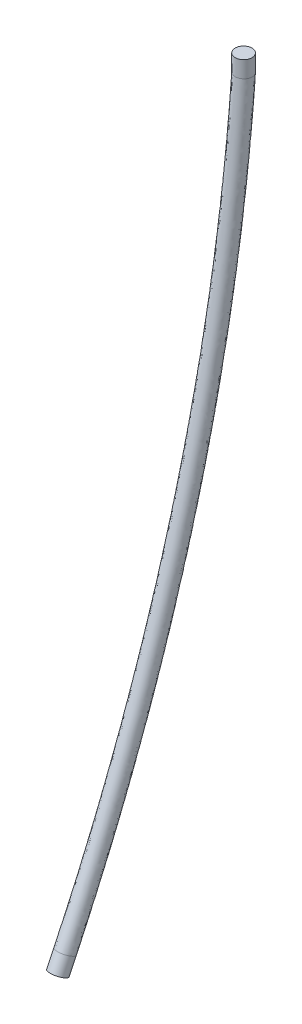
ISO-10303-21;
HEADER;
FILE_DESCRIPTION(('STEP AP214'),'2;1');
FILE_NAME('part.step','',(''),(''),'','','');
FILE_SCHEMA(('AUTOMOTIVE_DESIGN { 1 0 10303 214 1 1 1 1 }'));
ENDSEC;
DATA;
#1=APPLICATION_CONTEXT('core data for automotive mechanical design processes');
#2=APPLICATION_PROTOCOL_DEFINITION('international standard','automotive_design',2000,#1);
#3=PRODUCT_CONTEXT('',#1,'mechanical');
#4=PRODUCT('Part','Part','',(#3));
#5=PRODUCT_RELATED_PRODUCT_CATEGORY('part','',(#4));
#6=PRODUCT_DEFINITION_FORMATION('','',#4);
#7=PRODUCT_DEFINITION_CONTEXT('part definition',#1,'design');
#8=PRODUCT_DEFINITION('design','',#6,#7);
#9=PRODUCT_DEFINITION_SHAPE('','',#8);
#10=(LENGTH_UNIT() NAMED_UNIT(*) SI_UNIT(.MILLI.,.METRE.));
#11=(NAMED_UNIT(*) PLANE_ANGLE_UNIT() SI_UNIT($,.RADIAN.));
#12=(NAMED_UNIT(*) SI_UNIT($,.STERADIAN.) SOLID_ANGLE_UNIT());
#13=UNCERTAINTY_MEASURE_WITH_UNIT(LENGTH_MEASURE(1.E-05),#10,'distance_accuracy_value','');
#14=(GEOMETRIC_REPRESENTATION_CONTEXT(3) GLOBAL_UNCERTAINTY_ASSIGNED_CONTEXT((#13)) GLOBAL_UNIT_ASSIGNED_CONTEXT((#10,
#11,#12)) REPRESENTATION_CONTEXT('',''));
#15=CARTESIAN_POINT('',(0.,0.,0.));
#16=DIRECTION('',(0.,0.,1.));
#17=DIRECTION('',(1.,0.,0.));
#18=AXIS2_PLACEMENT_3D('',#15,#16,#17);
#19=CARTESIAN_POINT('',(2.53999999999998,-2082.79999999695,539.749999998546));
#20=DIRECTION('',(0.,-0.902771757915823,0.430119928751941));
#21=DIRECTION('',(0.,-0.430119928751941,-0.902771757915823));
#22=AXIS2_PLACEMENT_3D('',#19,#20,#21);
#23=CYLINDRICAL_SURFACE('',#22,25.4000000000003);
#24=CARTESIAN_POINT('',(2.53999999999998,-2082.79999999695,539.749999998546));
#25=DIRECTION('',(0.,-0.902771757916077,0.430119928751407));
#26=DIRECTION('',(0.,-0.430119928751407,-0.902771757916077));
#27=AXIS2_PLACEMENT_3D('',#24,#25,#26);
#28=CIRCLE('',#27,25.4000000000003);
#29=CARTESIAN_POINT('',(2.53999999999998,-2093.72504618723,516.819597347477));
#30=VERTEX_POINT('',#29);
#31=EDGE_CURVE('E49',#30,#30,#28,.T.);
#32=CARTESIAN_POINT('',(2.53999999999998,-2128.66080529907,561.600092379144));
#33=DIRECTION('',(0.,-0.902771757916077,0.430119928751407));
#34=DIRECTION('',(0.,-0.430119928751407,-0.902771757916077));
#35=AXIS2_PLACEMENT_3D('',#32,#33,#34);
#36=CIRCLE('',#35,25.4000000000003);
#37=CARTESIAN_POINT('',(2.53999999999998,-2139.58585148936,538.669689728075));
#38=VERTEX_POINT('',#37);
#39=EDGE_CURVE('E11',#38,#38,#36,.T.);
#40=CARTESIAN_POINT('',(2.53999999999998,-2093.72504618723,516.819597347477));
#41=CARTESIAN_POINT('',(2.53999999999998,-2094.20276290913,517.047202476442));
#42=CARTESIAN_POINT('',(2.53999999999998,-2094.68047963103,517.274807605406));
#43=CARTESIAN_POINT('',(2.53999999999998,-2095.63591307482,517.730017863335));
#44=CARTESIAN_POINT('',(2.53999999999998,-2096.11362979672,517.9576229923));
#45=CARTESIAN_POINT('',(2.53999999999998,-2097.06906324051,518.412833250229));
#46=CARTESIAN_POINT('',(2.53999999999998,-2097.54677996241,518.640438379194));
#47=CARTESIAN_POINT('',(2.53999999999998,-2098.50221340621,519.095648637123));
#48=CARTESIAN_POINT('',(2.53999999999998,-2098.9799301281,519.323253766087));
#49=CARTESIAN_POINT('',(2.53999999999998,-2099.9353635719,519.778464024017));
#50=CARTESIAN_POINT('',(2.53999999999998,-2100.41308029379,520.006069152981));
#51=CARTESIAN_POINT('',(2.53999999999998,-2101.36851373759,520.46127941091));
#52=CARTESIAN_POINT('',(2.53999999999998,-2101.84623045949,520.688884539875));
#53=CARTESIAN_POINT('',(2.53999999999998,-2102.80166390328,521.144094797804));
#54=CARTESIAN_POINT('',(2.53999999999998,-2103.27938062518,521.371699926768));
#55=CARTESIAN_POINT('',(2.53999999999998,-2104.23481406897,521.826910184698));
#56=CARTESIAN_POINT('',(2.53999999999998,-2104.71253079087,522.054515313662));
#57=CARTESIAN_POINT('',(2.53999999999998,-2105.66796423466,522.509725571591));
#58=CARTESIAN_POINT('',(2.53999999999998,-2106.14568095656,522.737330700556));
#59=CARTESIAN_POINT('',(2.53999999999998,-2107.10111440035,523.192540958485));
#60=CARTESIAN_POINT('',(2.53999999999998,-2107.57883112225,523.420146087449));
#61=CARTESIAN_POINT('',(2.53999999999998,-2108.53426456605,523.875356345379));
#62=CARTESIAN_POINT('',(2.53999999999998,-2109.01198128794,524.102961474343));
#63=CARTESIAN_POINT('',(2.53999999999998,-2109.96741473174,524.558171732272));
#64=CARTESIAN_POINT('',(2.53999999999998,-2110.44513145363,524.785776861237));
#65=CARTESIAN_POINT('',(2.53999999999998,-2111.40056489743,525.240987119166));
#66=CARTESIAN_POINT('',(2.53999999999998,-2111.87828161933,525.46859224813));
#67=CARTESIAN_POINT('',(2.53999999999998,-2112.83371506312,525.92380250606));
#68=CARTESIAN_POINT('',(2.53999999999998,-2113.31143178502,526.151407635024));
#69=CARTESIAN_POINT('',(2.53999999999998,-2114.26686522881,526.606617892953));
#70=CARTESIAN_POINT('',(2.53999999999998,-2114.74458195071,526.834223021918));
#71=CARTESIAN_POINT('',(2.53999999999998,-2115.7000153945,527.289433279847));
#72=CARTESIAN_POINT('',(2.53999999999998,-2116.1777321164,527.517038408812));
#73=CARTESIAN_POINT('',(2.53999999999998,-2117.13316556019,527.972248666741));
#74=CARTESIAN_POINT('',(2.53999999999998,-2117.61088228209,528.199853795705));
#75=CARTESIAN_POINT('',(2.53999999999998,-2118.56631572588,528.655064053634));
#76=CARTESIAN_POINT('',(2.53999999999998,-2119.04403244778,528.882669182599));
#77=CARTESIAN_POINT('',(2.53999999999998,-2119.99946589158,529.337879440528));
#78=CARTESIAN_POINT('',(2.53999999999998,-2120.47718261347,529.565484569493));
#79=CARTESIAN_POINT('',(2.53999999999998,-2121.43261605727,530.020694827422));
#80=CARTESIAN_POINT('',(2.53999999999998,-2121.91033277916,530.248299956386));
#81=CARTESIAN_POINT('',(2.53999999999998,-2122.86576622296,530.703510214316));
#82=CARTESIAN_POINT('',(2.53999999999998,-2123.34348294486,530.93111534328));
#83=CARTESIAN_POINT('',(2.53999999999998,-2124.29891638865,531.386325601209));
#84=CARTESIAN_POINT('',(2.53999999999998,-2124.77663311055,531.613930730174));
#85=CARTESIAN_POINT('',(2.53999999999998,-2125.73206655434,532.069140988103));
#86=CARTESIAN_POINT('',(2.53999999999998,-2126.20978327624,532.296746117067));
#87=CARTESIAN_POINT('',(2.53999999999998,-2127.16521672003,532.751956374997));
#88=CARTESIAN_POINT('',(2.53999999999998,-2127.64293344193,532.979561503961));
#89=CARTESIAN_POINT('',(2.53999999999998,-2128.59836688572,533.43477176189));
#90=CARTESIAN_POINT('',(2.53999999999998,-2129.07608360762,533.662376890855));
#91=CARTESIAN_POINT('',(2.53999999999998,-2130.03151705141,534.117587148784));
#92=CARTESIAN_POINT('',(2.53999999999998,-2130.50923377331,534.345192277748));
#93=CARTESIAN_POINT('',(2.53999999999998,-2131.46466721711,534.800402535678));
#94=CARTESIAN_POINT('',(2.53999999999998,-2131.942383939,535.028007664642));
#95=CARTESIAN_POINT('',(2.53999999999998,-2132.8978173828,535.483217922571));
#96=CARTESIAN_POINT('',(2.53999999999998,-2133.3755341047,535.710823051536));
#97=CARTESIAN_POINT('',(2.53999999999998,-2134.33096754849,536.166033309465));
#98=CARTESIAN_POINT('',(2.53999999999998,-2134.80868427039,536.393638438429));
#99=CARTESIAN_POINT('',(2.53999999999998,-2135.76411771418,536.848848696359));
#100=CARTESIAN_POINT('',(2.53999999999998,-2136.24183443608,537.076453825323));
#101=CARTESIAN_POINT('',(2.53999999999998,-2137.19726787987,537.531664083252));
#102=CARTESIAN_POINT('',(2.53999999999998,-2137.67498460177,537.759269212217));
#103=CARTESIAN_POINT('',(2.53999999999998,-2138.63041804556,538.214479470146));
#104=CARTESIAN_POINT('',(2.53999999999998,-2139.10813476746,538.442084599111));
#105=CARTESIAN_POINT('',(2.53999999999998,-2139.58585148936,538.669689728075));
#106=B_SPLINE_CURVE_WITH_KNOTS('',3,(#40,#41,#42,#43,#44,#45,#46,#47,#48,#49,#50,#51,#52,#53,
#54,#55,#56,#57,#58,#59,#60,#61,#62,#63,#64,#65,#66,#67,#68,#69,#70,#71,#72,#73,#74,#75,#76,#77,
#78,#79,#80,#81,#82,#83,#84,#85,#86,#87,#88,#89,#90,#91,#92,#93,#94,#95,#96,#97,#98,#99,#100,
#101,#102,#103,#104,#105),.UNSPECIFIED.,.F.,.F.,(4,2,2,2,2,2,2,2,2,2,2,2,2,2,2,2,2,2,2,2,2,2,2,
2,2,2,2,2,2,2,2,2,4),(0.,1.58749999999964,3.17499999999974,4.76249999999978,6.34999999999947,
7.93749999999952,9.52499999999961,11.1124999999997,12.6999999999994,14.2874999999994,
15.8749999999995,17.4624999999991,19.0499999999992,20.6374999999993,22.2249999999994,
23.812499999999,25.3999999999991,26.9874999999991,28.5749999999988,30.1624999999989,
31.749999999999,33.337499999999,34.9249999999987,36.5124999999988,38.0999999999989,
39.6874999999985,41.2749999999986,42.8624999999986,44.4499999999987,46.0374999999984,
47.6249999999985,49.2124999999985,50.7999999999986),.UNSPECIFIED.);
#107=EDGE_CURVE('BSEAM39',#30,#38,#106,.T.);
#108=ORIENTED_EDGE('',*,*,#31,.T.);
#109=ORIENTED_EDGE('',*,*,#39,.F.);
#110=ORIENTED_EDGE('',*,*,#107,.T.);
#111=ORIENTED_EDGE('',*,*,#107,.F.);
#112=EDGE_LOOP('',(#108,#110,#109,#111));
#113=FACE_BOUND('',#112,.T.);
#114=ADVANCED_FACE('F39',(#113),#23,.T.);
#115=CARTESIAN_POINT('',(2.53999999999999,0.,0.));
#116=DIRECTION('',(0.,1.,0.));
#117=DIRECTION('',(0.,0.,1.));
#118=AXIS2_PLACEMENT_3D('',#115,#116,#117);
#119=PLANE('',#118);
#120=CARTESIAN_POINT('',(2.53999999999999,0.,0.));
#121=DIRECTION('',(0.,1.,0.));
#122=DIRECTION('',(0.,0.,1.));
#123=AXIS2_PLACEMENT_3D('',#120,#121,#122);
#124=CIRCLE('',#123,25.4);
#125=CARTESIAN_POINT('',(2.53999999999999,0.,25.4));
#126=VERTEX_POINT('',#125);
#127=EDGE_CURVE('E45',#126,#126,#124,.T.);
#128=ORIENTED_EDGE('',*,*,#127,.T.);
#129=EDGE_LOOP('',(#128));
#130=FACE_BOUND('',#129,.T.);
#131=ADVANCED_FACE('F75',(#130),#119,.T.);
#132=CARTESIAN_POINT('',(2.53999999999999,-122.642048968553,0.));
#133=DIRECTION('',(0.,1.,0.));
#134=DIRECTION('',(0.,0.,1.));
#135=AXIS2_PLACEMENT_3D('',#132,#133,#134);
#136=CYLINDRICAL_SURFACE('',#135,25.4);
#137=ORIENTED_EDGE('',*,*,#127,.F.);
#138=EDGE_LOOP('',(#137));
#139=FACE_BOUND('',#138,.T.);
#140=CARTESIAN_POINT('',(2.53999999999999,-49.8517125381813,25.3999999998483));
#141=CARTESIAN_POINT('',(53.3399999999999,-49.8517125381813,25.3999999998483));
#142=CARTESIAN_POINT('',(53.3399999999999,-51.748287457762,-25.4000000001517));
#143=CARTESIAN_POINT('',(2.53999999999998,-51.748287457762,-25.4000000001517));
#144=CARTESIAN_POINT('',(-48.26,-51.748287457762,-25.4000000001517));
#145=CARTESIAN_POINT('',(-48.26,-49.8517125381813,25.3999999998483));
#146=CARTESIAN_POINT('',(2.53999999999999,-49.8517125381813,25.3999999998483));
#147=(BOUNDED_CURVE() B_SPLINE_CURVE(3,(#140,#141,#142,#143,#144,#145,#146),.UNSPECIFIED.,.T.,
.F.) B_SPLINE_CURVE_WITH_KNOTS((4,3,4),(0.,0.5,1.),
.UNSPECIFIED.) CURVE() GEOMETRIC_REPRESENTATION_ITEM() RATIONAL_B_SPLINE_CURVE((1.,
0.333333333333333,0.333333333333333,1.,0.333333333333333,0.333333333333333,1.)) REPRESENTATION_ITEM(''));
#148=CARTESIAN_POINT('',(2.53999999999999,-49.8517125381813,25.3999999998483));
#149=VERTEX_POINT('',#148);
#150=EDGE_CURVE('E53',#149,#149,#147,.T.);
#151=ORIENTED_EDGE('',*,*,#150,.T.);
#152=EDGE_LOOP('',(#151));
#153=FACE_BOUND('',#152,.T.);
#154=ADVANCED_FACE('F64',(#139,#153),#136,.T.);
#155=CARTESIAN_POINT('',(2.53999999999998,-2139.58585148936,538.669689728075));
#156=DIRECTION('',(0.,-0.902771757916077,0.430119928751407));
#157=DIRECTION('',(0.,-0.430119928751407,-0.902771757916077));
#158=AXIS2_PLACEMENT_3D('',#155,#156,#157);
#159=PLANE('',#158);
#160=ORIENTED_EDGE('',*,*,#39,.T.);
#161=EDGE_LOOP('',(#160));
#162=FACE_BOUND('',#161,.T.);
#163=ADVANCED_FACE('F69',(#162),#159,.T.);
#164=CARTESIAN_POINT('',(2.53999999999999,-49.8517125381813,25.3999999998483));
#165=CARTESIAN_POINT('',(2.53999999999999,-161.757048001423,33.7674444681181));
#166=CARTESIAN_POINT('',(2.53999999999999,-390.760875928582,57.7910151998846));
#167=CARTESIAN_POINT('',(2.53999999999999,-748.783675535288,117.735286481529));
#168=CARTESIAN_POINT('',(2.53999999999999,-1097.83172231654,200.253532329837));
#169=CARTESIAN_POINT('',(2.53999999999998,-1434.53576916788,302.167545080664));
#170=CARTESIAN_POINT('',(2.53999999999999,-1753.80606980275,419.349068322734));
#171=CARTESIAN_POINT('',(2.53999999999999,-1965.09749017698,511.806951363686));
#172=CARTESIAN_POINT('',(2.53999999999999,-2071.87495380666,562.680402649614));
#173=CARTESIAN_POINT('',(53.3399999999999,-49.8517125381813,25.3999999998483));
#174=CARTESIAN_POINT('',(53.3399999999999,-164.206288404259,33.9505803568167));
#175=CARTESIAN_POINT('',(53.3399999999999,-389.537054533492,57.7009261618553));
#176=CARTESIAN_POINT('',(53.34,-749.14037149146,117.756390758906));
#177=CARTESIAN_POINT('',(53.3399999999999,-1097.79985435071,200.271968516481));
#178=CARTESIAN_POINT('',(53.3399999999999,-1434.39665143896,302.09247667257));
#179=CARTESIAN_POINT('',(53.3399999999999,-1754.44595029853,419.656598277657));
#180=CARTESIAN_POINT('',(53.3399999999999,-1963.65191334442,511.118215369486));
#181=CARTESIAN_POINT('',(53.3399999999999,-2071.87495380666,562.680402649614));
#182=CARTESIAN_POINT('',(53.3399999999999,-51.748287457762,-25.4000000001517));
#183=CARTESIAN_POINT('',(53.3399999999999,-166.10286332384,-16.8494196431833));
#184=CARTESIAN_POINT('',(53.3399999999999,-397.856601291546,7.44244698382292));
#185=CARTESIAN_POINT('',(53.34,-758.794818829185,67.9011802971091));
#186=CARTESIAN_POINT('',(53.3399999999999,-1111.03669784597,151.166655924957));
#187=CARTESIAN_POINT('',(53.3399999999999,-1450.61366841281,253.942952466131));
#188=CARTESIAN_POINT('',(53.3399999999999,-1772.96836411812,372.282535418023));
#189=CARTESIAN_POINT('',(53.3399999999999,-1985.502005725,465.257410067349));
#190=CARTESIAN_POINT('',(53.3399999999999,-2093.72504618724,516.819597347477));
#191=CARTESIAN_POINT('',(2.53999999999998,-51.748287457762,-25.4000000001517));
#192=CARTESIAN_POINT('',(2.53999999999998,-164.878243122422,-16.9409875875326));
#193=CARTESIAN_POINT('',(2.53999999999998,-398.468511989091,7.48749150283761));
#194=CARTESIAN_POINT('',(2.53999999999998,-758.616470851099,67.8906281584205));
#195=CARTESIAN_POINT('',(2.53999999999998,-1111.05263182889,151.157437831635));
#196=CARTESIAN_POINT('',(2.53999999999998,-1450.68322727727,253.980486670179));
#197=CARTESIAN_POINT('',(2.53999999999998,-1772.64842387023,372.128770440562));
#198=CARTESIAN_POINT('',(2.53999999999998,-1986.22479414127,465.601778064449));
#199=CARTESIAN_POINT('',(2.53999999999998,-2093.72504618723,516.819597347477));
#200=CARTESIAN_POINT('',(-48.26,-51.748287457762,-25.4000000001517));
#201=CARTESIAN_POINT('',(-48.26,-163.653622921003,-17.0325555318819));
#202=CARTESIAN_POINT('',(-48.26,-399.080422686636,7.53253602185231));
#203=CARTESIAN_POINT('',(-48.26,-758.438122873013,67.8800760197318));
#204=CARTESIAN_POINT('',(-48.26,-1111.0685658118,151.148219738313));
#205=CARTESIAN_POINT('',(-48.26,-1450.75278614173,254.018020874226));
#206=CARTESIAN_POINT('',(-48.26,-1772.32848362234,371.9750054631));
#207=CARTESIAN_POINT('',(-48.26,-1986.94758255755,465.946146061549));
#208=CARTESIAN_POINT('',(-48.26,-2093.72504618724,516.819597347477));
#209=CARTESIAN_POINT('',(-48.26,-49.8517125381813,25.3999999998483));
#210=CARTESIAN_POINT('',(-48.26,-159.307807598586,33.5843085794195));
#211=CARTESIAN_POINT('',(-48.26,-391.984697323672,57.881104237914));
#212=CARTESIAN_POINT('',(-48.26,-748.426979579118,117.714182204152));
#213=CARTESIAN_POINT('',(-48.26,-1097.86359028237,200.235096143194));
#214=CARTESIAN_POINT('',(-48.26,-1434.67488689679,302.242613488758));
#215=CARTESIAN_POINT('',(-48.26,-1753.16618930697,419.041538367811));
#216=CARTESIAN_POINT('',(-48.26,-1966.54306700954,512.495687357886));
#217=CARTESIAN_POINT('',(-48.26,-2071.87495380666,562.680402649614));
#218=CARTESIAN_POINT('',(2.53999999999999,-49.8517125381813,25.3999999998483));
#219=CARTESIAN_POINT('',(2.53999999999999,-161.757048001423,33.7674444681181));
#220=CARTESIAN_POINT('',(2.53999999999999,-390.760875928582,57.7910151998846));
#221=CARTESIAN_POINT('',(2.53999999999999,-748.783675535288,117.735286481529));
#222=CARTESIAN_POINT('',(2.53999999999999,-1097.83172231654,200.253532329837));
#223=CARTESIAN_POINT('',(2.53999999999998,-1434.53576916788,302.167545080664));
#224=CARTESIAN_POINT('',(2.53999999999999,-1753.80606980275,419.349068322734));
#225=CARTESIAN_POINT('',(2.53999999999999,-1965.09749017698,511.806951363686));
#226=CARTESIAN_POINT('',(2.53999999999999,-2071.87495380666,562.680402649614));
#227=(BOUNDED_SURFACE() B_SPLINE_SURFACE(3,3,((#164,#165,#166,#167,#168,#169,#170,#171,#172),
(#173,#174,#175,#176,#177,#178,#179,#180,#181),(#182,#183,#184,#185,#186,#187,#188,#189,#190),
(#191,#192,#193,#194,#195,#196,#197,#198,#199),(#200,#201,#202,#203,#204,#205,#206,#207,#208),
(#209,#210,#211,#212,#213,#214,#215,#216,#217),(#218,#219,#220,#221,#222,#223,#224,#225,#226)),
.UNSPECIFIED.,.T.,.F.,.F.) B_SPLINE_SURFACE_WITH_KNOTS((4,3,4),(4,1,1,1,1,1,4),(0.,0.5,1.),(0.,
0.159189893402934,0.330926447077637,0.515892540357006,0.670363015625064,0.832147250627935,1.),
.UNSPECIFIED.) GEOMETRIC_REPRESENTATION_ITEM() RATIONAL_B_SPLINE_SURFACE(((1.,1.,1.,1.,1.,1.,1.,
1.,1.),(0.333333333333333,0.333333333333333,0.333333333333333,0.333333333333333,
0.333333333333333,0.333333333333333,0.333333333333333,0.333333333333333,0.333333333333333),
(0.333333333333333,0.333333333333333,0.333333333333333,0.333333333333333,0.333333333333333,
0.333333333333333,0.333333333333333,0.333333333333333,0.333333333333333),(1.,1.,1.,1.,1.,1.,1.,
1.,1.),(0.333333333333333,0.333333333333333,0.333333333333333,0.333333333333333,
0.333333333333333,0.333333333333333,0.333333333333333,0.333333333333333,0.333333333333333),
(0.333333333333333,0.333333333333333,0.333333333333333,0.333333333333333,0.333333333333333,
0.333333333333333,0.333333333333333,0.333333333333333,0.333333333333333),(1.,1.,1.,1.,1.,1.,1.,
1.,1.))) REPRESENTATION_ITEM('') SURFACE());
#228=ORIENTED_EDGE('',*,*,#150,.F.);
#229=EDGE_LOOP('',(#228));
#230=FACE_BOUND('',#229,.T.);
#231=ORIENTED_EDGE('',*,*,#31,.F.);
#232=EDGE_LOOP('',(#231));
#233=FACE_BOUND('',#232,.T.);
#234=ADVANCED_FACE('F66',(#230,#233),#227,.F.);
#235=CLOSED_SHELL('',(#114,#131,#154,#163,#234));
#236=MANIFOLD_SOLID_BREP('B2',#235);
#237=ADVANCED_BREP_SHAPE_REPRESENTATION('',(#18,#236),#14);
#238=SHAPE_DEFINITION_REPRESENTATION(#9,#237);
ENDSEC;
END-ISO-10303-21;
